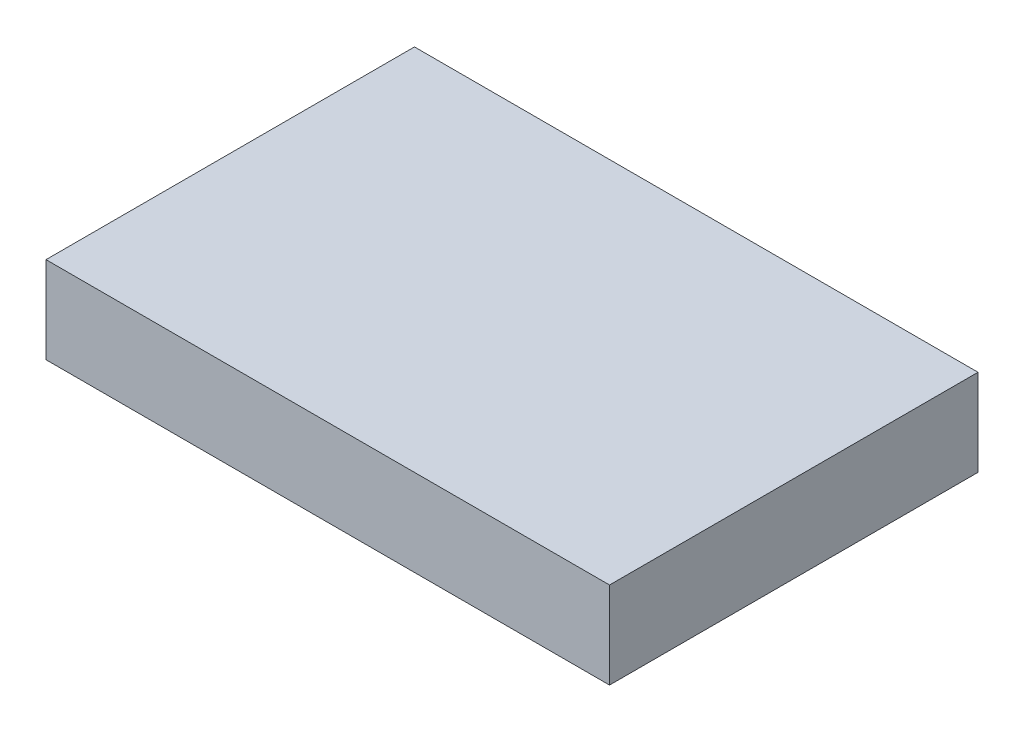
ISO-10303-21;
HEADER;
FILE_DESCRIPTION(('STEP AP214'),'2;1');
FILE_NAME('part.step','',(''),(''),'','','');
FILE_SCHEMA(('AUTOMOTIVE_DESIGN { 1 0 10303 214 1 1 1 1 }'));
ENDSEC;
DATA;
#1=APPLICATION_CONTEXT('core data for automotive mechanical design processes');
#2=APPLICATION_PROTOCOL_DEFINITION('international standard','automotive_design',2000,#1);
#3=PRODUCT_CONTEXT('',#1,'mechanical');
#4=PRODUCT('Part','Part','',(#3));
#5=PRODUCT_RELATED_PRODUCT_CATEGORY('part','',(#4));
#6=PRODUCT_DEFINITION_FORMATION('','',#4);
#7=PRODUCT_DEFINITION_CONTEXT('part definition',#1,'design');
#8=PRODUCT_DEFINITION('design','',#6,#7);
#9=PRODUCT_DEFINITION_SHAPE('','',#8);
#10=(LENGTH_UNIT() NAMED_UNIT(*) SI_UNIT(.MILLI.,.METRE.));
#11=(NAMED_UNIT(*) PLANE_ANGLE_UNIT() SI_UNIT($,.RADIAN.));
#12=(NAMED_UNIT(*) SI_UNIT($,.STERADIAN.) SOLID_ANGLE_UNIT());
#13=UNCERTAINTY_MEASURE_WITH_UNIT(LENGTH_MEASURE(1.E-05),#10,'distance_accuracy_value','');
#14=(GEOMETRIC_REPRESENTATION_CONTEXT(3) GLOBAL_UNCERTAINTY_ASSIGNED_CONTEXT((#13)) GLOBAL_UNIT_ASSIGNED_CONTEXT((#10,
#11,#12)) REPRESENTATION_CONTEXT('',''));
#15=CARTESIAN_POINT('',(0.,0.,0.));
#16=DIRECTION('',(0.,0.,1.));
#17=DIRECTION('',(1.,0.,0.));
#18=AXIS2_PLACEMENT_3D('',#15,#16,#17);
#19=CARTESIAN_POINT('',(13.,4.,-8.5));
#20=DIRECTION('',(-1.,0.,0.));
#21=DIRECTION('',(0.,0.,1.));
#22=AXIS2_PLACEMENT_3D('',#19,#20,#21);
#23=PLANE('',#22);
#24=DIRECTION('',(0.,0.,-1.));
#25=VECTOR('',#24,1.);
#26=CARTESIAN_POINT('',(13.,0.,-8.5));
#27=LINE('',#26,#25);
#28=CARTESIAN_POINT('',(13.,0.,8.5));
#29=VERTEX_POINT('',#28);
#30=CARTESIAN_POINT('',(13.,0.,-8.5));
#31=VERTEX_POINT('',#30);
#32=EDGE_CURVE('E106',#29,#31,#27,.T.);
#33=ORIENTED_EDGE('',*,*,#32,.T.);
#34=DIRECTION('',(0.,-1.,0.));
#35=VECTOR('',#34,1.);
#36=CARTESIAN_POINT('',(13.,4.,-8.5));
#37=LINE('',#36,#35);
#38=CARTESIAN_POINT('',(13.,4.,-8.5));
#39=VERTEX_POINT('',#38);
#40=EDGE_CURVE('E11',#39,#31,#37,.T.);
#41=ORIENTED_EDGE('',*,*,#40,.F.);
#42=DIRECTION('',(0.,0.,-1.));
#43=VECTOR('',#42,1.);
#44=CARTESIAN_POINT('',(13.,4.,-8.5));
#45=LINE('',#44,#43);
#46=CARTESIAN_POINT('',(13.,4.,8.5));
#47=VERTEX_POINT('',#46);
#48=EDGE_CURVE('E94',#47,#39,#45,.T.);
#49=ORIENTED_EDGE('',*,*,#48,.F.);
#50=DIRECTION('',(0.,-1.,0.));
#51=VECTOR('',#50,1.);
#52=CARTESIAN_POINT('',(13.,4.,8.5));
#53=LINE('',#52,#51);
#54=EDGE_CURVE('E102',#47,#29,#53,.T.);
#55=ORIENTED_EDGE('',*,*,#54,.T.);
#56=EDGE_LOOP('',(#33,#41,#49,#55));
#57=FACE_BOUND('',#56,.T.);
#58=ADVANCED_FACE('F43',(#57),#23,.F.);
#59=CARTESIAN_POINT('',(-13.,4.,-8.5));
#60=DIRECTION('',(0.,0.,1.));
#61=DIRECTION('',(1.,0.,0.));
#62=AXIS2_PLACEMENT_3D('',#59,#60,#61);
#63=PLANE('',#62);
#64=DIRECTION('',(-1.,0.,0.));
#65=VECTOR('',#64,1.);
#66=CARTESIAN_POINT('',(-13.,0.,-8.5));
#67=LINE('',#66,#65);
#68=CARTESIAN_POINT('',(-13.,0.,-8.5));
#69=VERTEX_POINT('',#68);
#70=EDGE_CURVE('E98',#31,#69,#67,.T.);
#71=ORIENTED_EDGE('',*,*,#70,.T.);
#72=DIRECTION('',(0.,-1.,0.));
#73=VECTOR('',#72,1.);
#74=CARTESIAN_POINT('',(-13.,4.,-8.5));
#75=LINE('',#74,#73);
#76=CARTESIAN_POINT('',(-13.,4.,-8.5));
#77=VERTEX_POINT('',#76);
#78=EDGE_CURVE('E51',#77,#69,#75,.T.);
#79=ORIENTED_EDGE('',*,*,#78,.F.);
#80=DIRECTION('',(-1.,0.,0.));
#81=VECTOR('',#80,1.);
#82=CARTESIAN_POINT('',(-13.,4.,-8.5));
#83=LINE('',#82,#81);
#84=EDGE_CURVE('E89',#39,#77,#83,.T.);
#85=ORIENTED_EDGE('',*,*,#84,.F.);
#86=ORIENTED_EDGE('',*,*,#40,.T.);
#87=EDGE_LOOP('',(#71,#79,#85,#86));
#88=FACE_BOUND('',#87,.T.);
#89=ADVANCED_FACE('F97',(#88),#63,.F.);
#90=CARTESIAN_POINT('',(-13.,4.,-8.5));
#91=DIRECTION('',(1.,0.,0.));
#92=DIRECTION('',(0.,0.,-1.));
#93=AXIS2_PLACEMENT_3D('',#90,#91,#92);
#94=PLANE('',#93);
#95=DIRECTION('',(0.,0.,1.));
#96=VECTOR('',#95,1.);
#97=CARTESIAN_POINT('',(-13.,0.,-8.5));
#98=LINE('',#97,#96);
#99=CARTESIAN_POINT('',(-13.,0.,8.5));
#100=VERTEX_POINT('',#99);
#101=EDGE_CURVE('E76',#69,#100,#98,.T.);
#102=ORIENTED_EDGE('',*,*,#101,.T.);
#103=DIRECTION('',(0.,-1.,0.));
#104=VECTOR('',#103,1.);
#105=CARTESIAN_POINT('',(-13.,4.,8.5));
#106=LINE('',#105,#104);
#107=CARTESIAN_POINT('',(-13.,4.,8.5));
#108=VERTEX_POINT('',#107);
#109=EDGE_CURVE('E99',#108,#100,#106,.T.);
#110=ORIENTED_EDGE('',*,*,#109,.F.);
#111=DIRECTION('',(0.,0.,1.));
#112=VECTOR('',#111,1.);
#113=CARTESIAN_POINT('',(-13.,4.,-8.5));
#114=LINE('',#113,#112);
#115=EDGE_CURVE('E92',#77,#108,#114,.T.);
#116=ORIENTED_EDGE('',*,*,#115,.F.);
#117=ORIENTED_EDGE('',*,*,#78,.T.);
#118=EDGE_LOOP('',(#102,#110,#116,#117));
#119=FACE_BOUND('',#118,.T.);
#120=ADVANCED_FACE('F100',(#119),#94,.F.);
#121=CARTESIAN_POINT('',(-13.,4.,8.5));
#122=DIRECTION('',(0.,0.,-1.));
#123=DIRECTION('',(-1.,0.,0.));
#124=AXIS2_PLACEMENT_3D('',#121,#122,#123);
#125=PLANE('',#124);
#126=DIRECTION('',(1.,0.,0.));
#127=VECTOR('',#126,1.);
#128=CARTESIAN_POINT('',(-13.,0.,8.5));
#129=LINE('',#128,#127);
#130=EDGE_CURVE('E82',#100,#29,#129,.T.);
#131=ORIENTED_EDGE('',*,*,#130,.T.);
#132=ORIENTED_EDGE('',*,*,#54,.F.);
#133=DIRECTION('',(1.,0.,0.));
#134=VECTOR('',#133,1.);
#135=CARTESIAN_POINT('',(-13.,4.,8.5));
#136=LINE('',#135,#134);
#137=EDGE_CURVE('E59',#108,#47,#136,.T.);
#138=ORIENTED_EDGE('',*,*,#137,.F.);
#139=ORIENTED_EDGE('',*,*,#109,.T.);
#140=EDGE_LOOP('',(#131,#132,#138,#139));
#141=FACE_BOUND('',#140,.T.);
#142=ADVANCED_FACE('F113',(#141),#125,.F.);
#143=CARTESIAN_POINT('',(0.,4.,0.));
#144=DIRECTION('',(0.,1.,0.));
#145=DIRECTION('',(0.,0.,1.));
#146=AXIS2_PLACEMENT_3D('',#143,#144,#145);
#147=PLANE('',#146);
#148=ORIENTED_EDGE('',*,*,#48,.T.);
#149=ORIENTED_EDGE('',*,*,#84,.T.);
#150=ORIENTED_EDGE('',*,*,#115,.T.);
#151=ORIENTED_EDGE('',*,*,#137,.T.);
#152=EDGE_LOOP('',(#148,#149,#150,#151));
#153=FACE_BOUND('',#152,.T.);
#154=ADVANCED_FACE('F90',(#153),#147,.T.);
#155=CARTESIAN_POINT('',(0.,0.,0.));
#156=DIRECTION('',(0.,1.,0.));
#157=DIRECTION('',(0.,0.,1.));
#158=AXIS2_PLACEMENT_3D('',#155,#156,#157);
#159=PLANE('',#158);
#160=ORIENTED_EDGE('',*,*,#32,.F.);
#161=ORIENTED_EDGE('',*,*,#130,.F.);
#162=ORIENTED_EDGE('',*,*,#101,.F.);
#163=ORIENTED_EDGE('',*,*,#70,.F.);
#164=EDGE_LOOP('',(#160,#161,#162,#163));
#165=FACE_BOUND('',#164,.T.);
#166=ADVANCED_FACE('F116',(#165),#159,.F.);
#167=CLOSED_SHELL('',(#58,#89,#120,#142,#154,#166));
#168=MANIFOLD_SOLID_BREP('B2',#167);
#169=ADVANCED_BREP_SHAPE_REPRESENTATION('',(#18,#168),#14);
#170=SHAPE_DEFINITION_REPRESENTATION(#9,#169);
ENDSEC;
END-ISO-10303-21;
